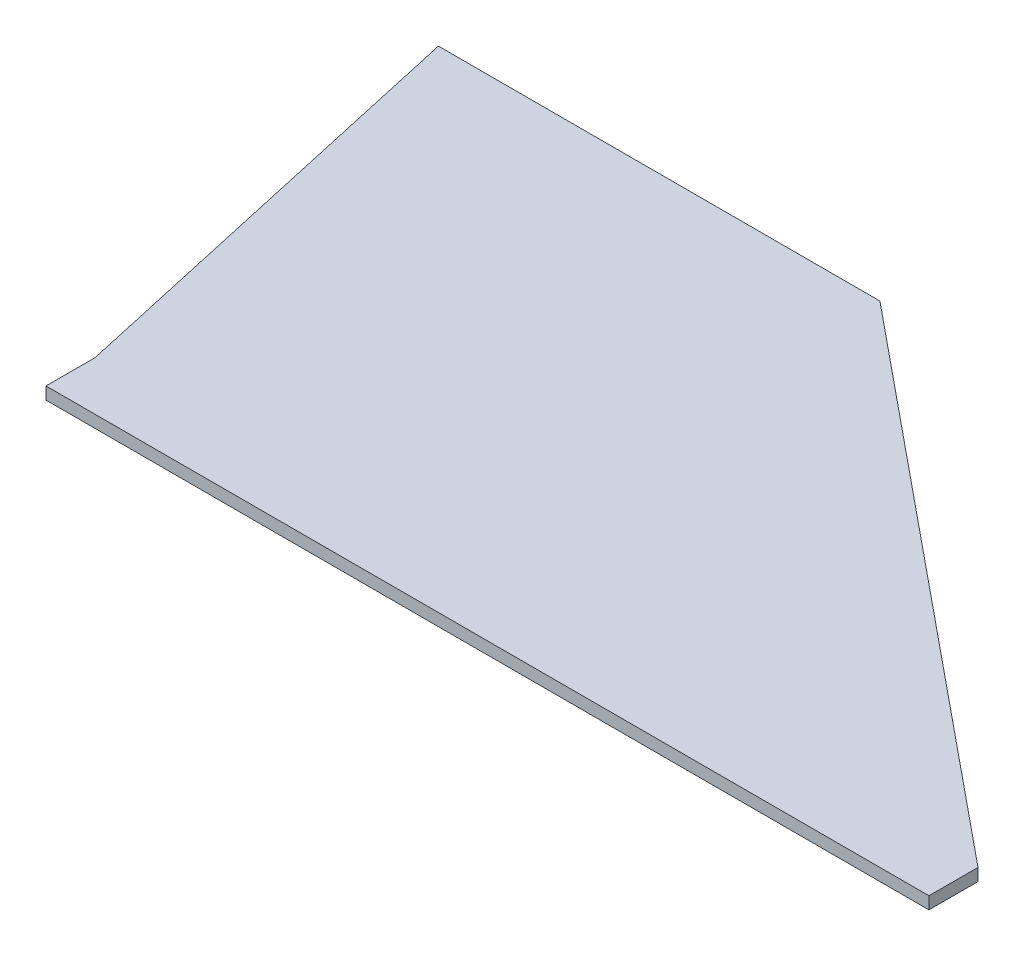
ISO-10303-21;
HEADER;
FILE_DESCRIPTION(('STEP AP214'),'2;1');
FILE_NAME('part.step','',(''),(''),'','','');
FILE_SCHEMA(('AUTOMOTIVE_DESIGN { 1 0 10303 214 1 1 1 1 }'));
ENDSEC;
DATA;
#1=APPLICATION_CONTEXT('core data for automotive mechanical design processes');
#2=APPLICATION_PROTOCOL_DEFINITION('international standard','automotive_design',2000,#1);
#3=PRODUCT_CONTEXT('',#1,'mechanical');
#4=PRODUCT('Part','Part','',(#3));
#5=PRODUCT_RELATED_PRODUCT_CATEGORY('part','',(#4));
#6=PRODUCT_DEFINITION_FORMATION('','',#4);
#7=PRODUCT_DEFINITION_CONTEXT('part definition',#1,'design');
#8=PRODUCT_DEFINITION('design','',#6,#7);
#9=PRODUCT_DEFINITION_SHAPE('','',#8);
#10=(LENGTH_UNIT() NAMED_UNIT(*) SI_UNIT(.MILLI.,.METRE.));
#11=(NAMED_UNIT(*) PLANE_ANGLE_UNIT() SI_UNIT($,.RADIAN.));
#12=(NAMED_UNIT(*) SI_UNIT($,.STERADIAN.) SOLID_ANGLE_UNIT());
#13=UNCERTAINTY_MEASURE_WITH_UNIT(LENGTH_MEASURE(1.E-05),#10,'distance_accuracy_value','');
#14=(GEOMETRIC_REPRESENTATION_CONTEXT(3) GLOBAL_UNCERTAINTY_ASSIGNED_CONTEXT((#13)) GLOBAL_UNIT_ASSIGNED_CONTEXT((#10,
#11,#12)) REPRESENTATION_CONTEXT('',''));
#15=CARTESIAN_POINT('',(0.,0.,0.));
#16=DIRECTION('',(0.,0.,1.));
#17=DIRECTION('',(1.,0.,0.));
#18=AXIS2_PLACEMENT_3D('',#15,#16,#17);
#19=CARTESIAN_POINT('',(0.,6.35,0.));
#20=DIRECTION('',(1.,0.,0.));
#21=DIRECTION('',(0.,0.,-1.));
#22=AXIS2_PLACEMENT_3D('',#19,#20,#21);
#23=PLANE('',#22);
#24=DIRECTION('',(0.,0.,1.));
#25=VECTOR('',#24,1.);
#26=CARTESIAN_POINT('',(0.,0.,0.));
#27=LINE('',#26,#25);
#28=CARTESIAN_POINT('',(0.,0.,-25.4));
#29=VERTEX_POINT('',#28);
#30=CARTESIAN_POINT('',(0.,0.,0.));
#31=VERTEX_POINT('',#30);
#32=EDGE_CURVE('E132',#29,#31,#27,.T.);
#33=ORIENTED_EDGE('',*,*,#32,.T.);
#34=DIRECTION('',(0.,-1.,0.));
#35=VECTOR('',#34,1.);
#36=CARTESIAN_POINT('',(0.,6.35,0.));
#37=LINE('',#36,#35);
#38=CARTESIAN_POINT('',(0.,6.35,0.));
#39=VERTEX_POINT('',#38);
#40=EDGE_CURVE('E11',#39,#31,#37,.T.);
#41=ORIENTED_EDGE('',*,*,#40,.F.);
#42=DIRECTION('',(0.,0.,1.));
#43=VECTOR('',#42,1.);
#44=CARTESIAN_POINT('',(0.,6.35,0.));
#45=LINE('',#44,#43);
#46=CARTESIAN_POINT('',(0.,6.35,-25.4));
#47=VERTEX_POINT('',#46);
#48=EDGE_CURVE('E148',#47,#39,#45,.T.);
#49=ORIENTED_EDGE('',*,*,#48,.F.);
#50=DIRECTION('',(0.,-1.,0.));
#51=VECTOR('',#50,1.);
#52=CARTESIAN_POINT('',(0.,6.35,-25.4));
#53=LINE('',#52,#51);
#54=EDGE_CURVE('E128',#47,#29,#53,.T.);
#55=ORIENTED_EDGE('',*,*,#54,.T.);
#56=EDGE_LOOP('',(#33,#41,#49,#55));
#57=FACE_BOUND('',#56,.T.);
#58=ADVANCED_FACE('F43',(#57),#23,.F.);
#59=CARTESIAN_POINT('',(0.,6.35,0.));
#60=DIRECTION('',(0.,0.,-1.));
#61=DIRECTION('',(-1.,0.,0.));
#62=AXIS2_PLACEMENT_3D('',#59,#60,#61);
#63=PLANE('',#62);
#64=DIRECTION('',(1.,0.,0.));
#65=VECTOR('',#64,1.);
#66=CARTESIAN_POINT('',(0.,0.,0.));
#67=LINE('',#66,#65);
#68=CARTESIAN_POINT('',(457.2,0.,0.));
#69=VERTEX_POINT('',#68);
#70=EDGE_CURVE('E136',#31,#69,#67,.T.);
#71=ORIENTED_EDGE('',*,*,#70,.T.);
#72=DIRECTION('',(0.,-1.,0.));
#73=VECTOR('',#72,1.);
#74=CARTESIAN_POINT('',(457.2,6.35,0.));
#75=LINE('',#74,#73);
#76=CARTESIAN_POINT('',(457.2,6.35,0.));
#77=VERTEX_POINT('',#76);
#78=EDGE_CURVE('E52',#77,#69,#75,.T.);
#79=ORIENTED_EDGE('',*,*,#78,.F.);
#80=DIRECTION('',(1.,0.,0.));
#81=VECTOR('',#80,1.);
#82=CARTESIAN_POINT('',(0.,6.35,0.));
#83=LINE('',#82,#81);
#84=EDGE_CURVE('E97',#39,#77,#83,.T.);
#85=ORIENTED_EDGE('',*,*,#84,.F.);
#86=ORIENTED_EDGE('',*,*,#40,.T.);
#87=EDGE_LOOP('',(#71,#79,#85,#86));
#88=FACE_BOUND('',#87,.T.);
#89=ADVANCED_FACE('F176',(#88),#63,.F.);
#90=CARTESIAN_POINT('',(457.2,6.35,0.));
#91=DIRECTION('',(-1.,0.,0.));
#92=DIRECTION('',(0.,0.,1.));
#93=AXIS2_PLACEMENT_3D('',#90,#91,#92);
#94=PLANE('',#93);
#95=DIRECTION('',(0.,0.,-1.));
#96=VECTOR('',#95,1.);
#97=CARTESIAN_POINT('',(457.2,0.,0.));
#98=LINE('',#97,#96);
#99=CARTESIAN_POINT('',(457.2,0.,-25.4));
#100=VERTEX_POINT('',#99);
#101=EDGE_CURVE('E139',#69,#100,#98,.T.);
#102=ORIENTED_EDGE('',*,*,#101,.T.);
#103=DIRECTION('',(0.,-1.,0.));
#104=VECTOR('',#103,1.);
#105=CARTESIAN_POINT('',(457.2,6.35,-25.4));
#106=LINE('',#105,#104);
#107=CARTESIAN_POINT('',(457.2,6.35,-25.4));
#108=VERTEX_POINT('',#107);
#109=EDGE_CURVE('E121',#108,#100,#106,.T.);
#110=ORIENTED_EDGE('',*,*,#109,.F.);
#111=DIRECTION('',(0.,0.,-1.));
#112=VECTOR('',#111,1.);
#113=CARTESIAN_POINT('',(457.2,6.35,0.));
#114=LINE('',#113,#112);
#115=EDGE_CURVE('E110',#77,#108,#114,.T.);
#116=ORIENTED_EDGE('',*,*,#115,.F.);
#117=ORIENTED_EDGE('',*,*,#78,.T.);
#118=EDGE_LOOP('',(#102,#110,#116,#117));
#119=FACE_BOUND('',#118,.T.);
#120=ADVANCED_FACE('F158',(#119),#94,.F.);
#121=CARTESIAN_POINT('',(177.8,6.35,-254.));
#122=DIRECTION('',(-0.633237790257263,0.,0.773957299203321));
#123=DIRECTION('',(0.773957299203321,0.,0.633237790257263));
#124=AXIS2_PLACEMENT_3D('',#121,#122,#123);
#125=PLANE('',#124);
#126=DIRECTION('',(-0.773957299203321,0.,-0.633237790257263));
#127=VECTOR('',#126,1.);
#128=CARTESIAN_POINT('',(177.8,0.,-254.));
#129=LINE('',#128,#127);
#130=CARTESIAN_POINT('',(177.8,0.,-254.));
#131=VERTEX_POINT('',#130);
#132=EDGE_CURVE('E119',#100,#131,#129,.T.);
#133=ORIENTED_EDGE('',*,*,#132,.T.);
#134=DIRECTION('',(0.,-1.,0.));
#135=VECTOR('',#134,1.);
#136=CARTESIAN_POINT('',(177.8,6.35,-254.));
#137=LINE('',#136,#135);
#138=CARTESIAN_POINT('',(177.8,6.35,-254.));
#139=VERTEX_POINT('',#138);
#140=EDGE_CURVE('E116',#139,#131,#137,.T.);
#141=ORIENTED_EDGE('',*,*,#140,.F.);
#142=DIRECTION('',(-0.773957299203321,0.,-0.633237790257263));
#143=VECTOR('',#142,1.);
#144=CARTESIAN_POINT('',(177.8,6.35,-254.));
#145=LINE('',#144,#143);
#146=EDGE_CURVE('E104',#108,#139,#145,.T.);
#147=ORIENTED_EDGE('',*,*,#146,.F.);
#148=ORIENTED_EDGE('',*,*,#109,.T.);
#149=EDGE_LOOP('',(#133,#141,#147,#148));
#150=FACE_BOUND('',#149,.T.);
#151=ADVANCED_FACE('F117',(#150),#125,.F.);
#152=CARTESIAN_POINT('',(-50.8,6.35,-254.));
#153=DIRECTION('',(0.,0.,1.));
#154=DIRECTION('',(1.,0.,0.));
#155=AXIS2_PLACEMENT_3D('',#152,#153,#154);
#156=PLANE('',#155);
#157=DIRECTION('',(-1.,0.,0.));
#158=VECTOR('',#157,1.);
#159=CARTESIAN_POINT('',(-50.8,0.,-254.));
#160=LINE('',#159,#158);
#161=CARTESIAN_POINT('',(-50.8,0.,-254.));
#162=VERTEX_POINT('',#161);
#163=EDGE_CURVE('E83',#131,#162,#160,.T.);
#164=ORIENTED_EDGE('',*,*,#163,.T.);
#165=DIRECTION('',(0.,-1.,0.));
#166=VECTOR('',#165,1.);
#167=CARTESIAN_POINT('',(-50.8,6.35,-254.));
#168=LINE('',#167,#166);
#169=CARTESIAN_POINT('',(-50.8,6.35,-254.));
#170=VERTEX_POINT('',#169);
#171=EDGE_CURVE('E122',#170,#162,#168,.T.);
#172=ORIENTED_EDGE('',*,*,#171,.F.);
#173=DIRECTION('',(-1.,0.,0.));
#174=VECTOR('',#173,1.);
#175=CARTESIAN_POINT('',(-50.8,6.35,-254.));
#176=LINE('',#175,#174);
#177=EDGE_CURVE('E108',#139,#170,#176,.T.);
#178=ORIENTED_EDGE('',*,*,#177,.F.);
#179=ORIENTED_EDGE('',*,*,#140,.T.);
#180=EDGE_LOOP('',(#164,#172,#178,#179));
#181=FACE_BOUND('',#180,.T.);
#182=ADVANCED_FACE('F124',(#181),#156,.F.);
#183=CARTESIAN_POINT('',(0.,6.35,-25.4));
#184=DIRECTION('',(0.976187060183953,0.,-0.216930457818656));
#185=DIRECTION('',(-0.216930457818656,0.,-0.976187060183953));
#186=AXIS2_PLACEMENT_3D('',#183,#184,#185);
#187=PLANE('',#186);
#188=DIRECTION('',(0.216930457818656,0.,0.976187060183953));
#189=VECTOR('',#188,1.);
#190=CARTESIAN_POINT('',(0.,0.,-25.4));
#191=LINE('',#190,#189);
#192=EDGE_CURVE('E89',#162,#29,#191,.T.);
#193=ORIENTED_EDGE('',*,*,#192,.T.);
#194=ORIENTED_EDGE('',*,*,#54,.F.);
#195=DIRECTION('',(0.216930457818656,0.,0.976187060183953));
#196=VECTOR('',#195,1.);
#197=CARTESIAN_POINT('',(0.,6.35,-25.4));
#198=LINE('',#197,#196);
#199=EDGE_CURVE('E60',#170,#47,#198,.T.);
#200=ORIENTED_EDGE('',*,*,#199,.F.);
#201=ORIENTED_EDGE('',*,*,#171,.T.);
#202=EDGE_LOOP('',(#193,#194,#200,#201));
#203=FACE_BOUND('',#202,.T.);
#204=ADVANCED_FACE('F165',(#203),#187,.F.);
#205=CARTESIAN_POINT('',(0.,6.35,0.));
#206=DIRECTION('',(0.,-1.,0.));
#207=DIRECTION('',(0.,0.,-1.));
#208=AXIS2_PLACEMENT_3D('',#205,#206,#207);
#209=PLANE('',#208);
#210=ORIENTED_EDGE('',*,*,#48,.T.);
#211=ORIENTED_EDGE('',*,*,#84,.T.);
#212=ORIENTED_EDGE('',*,*,#115,.T.);
#213=ORIENTED_EDGE('',*,*,#146,.T.);
#214=ORIENTED_EDGE('',*,*,#177,.T.);
#215=ORIENTED_EDGE('',*,*,#199,.T.);
#216=EDGE_LOOP('',(#210,#211,#212,#213,#214,#215));
#217=FACE_BOUND('',#216,.T.);
#218=ADVANCED_FACE('F106',(#217),#209,.F.);
#219=CARTESIAN_POINT('',(0.,0.,0.));
#220=DIRECTION('',(0.,-1.,0.));
#221=DIRECTION('',(0.,0.,-1.));
#222=AXIS2_PLACEMENT_3D('',#219,#220,#221);
#223=PLANE('',#222);
#224=ORIENTED_EDGE('',*,*,#32,.F.);
#225=ORIENTED_EDGE('',*,*,#192,.F.);
#226=ORIENTED_EDGE('',*,*,#163,.F.);
#227=ORIENTED_EDGE('',*,*,#132,.F.);
#228=ORIENTED_EDGE('',*,*,#101,.F.);
#229=ORIENTED_EDGE('',*,*,#70,.F.);
#230=EDGE_LOOP('',(#224,#225,#226,#227,#228,#229));
#231=FACE_BOUND('',#230,.T.);
#232=ADVANCED_FACE('F161',(#231),#223,.T.);
#233=CLOSED_SHELL('',(#58,#89,#120,#151,#182,#204,#218,#232));
#234=MANIFOLD_SOLID_BREP('B2',#233);
#235=ADVANCED_BREP_SHAPE_REPRESENTATION('',(#18,#234),#14);
#236=SHAPE_DEFINITION_REPRESENTATION(#9,#235);
ENDSEC;
END-ISO-10303-21;
